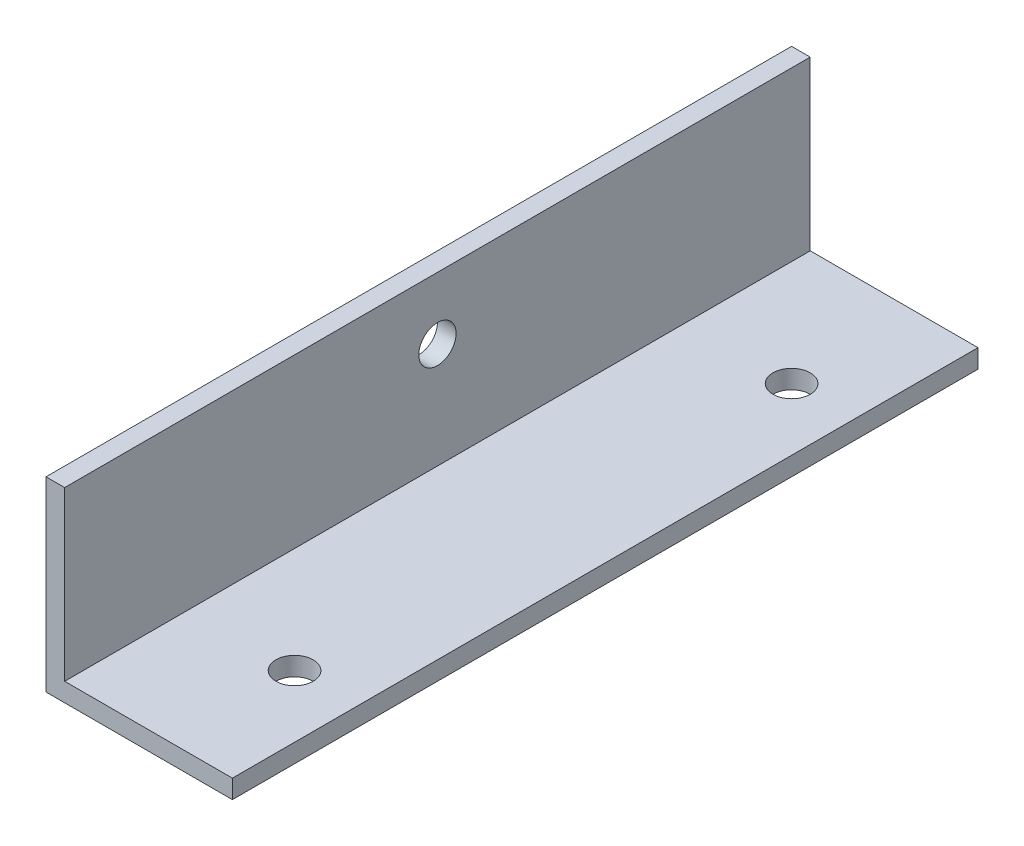
ISO-10303-21;
HEADER;
FILE_DESCRIPTION(('STEP AP214'),'2;1');
FILE_NAME('part.step','',(''),(''),'','','');
FILE_SCHEMA(('AUTOMOTIVE_DESIGN { 1 0 10303 214 1 1 1 1 }'));
ENDSEC;
DATA;
#1=APPLICATION_CONTEXT('core data for automotive mechanical design processes');
#2=APPLICATION_PROTOCOL_DEFINITION('international standard','automotive_design',2000,#1);
#3=PRODUCT_CONTEXT('',#1,'mechanical');
#4=PRODUCT('Part','Part','',(#3));
#5=PRODUCT_RELATED_PRODUCT_CATEGORY('part','',(#4));
#6=PRODUCT_DEFINITION_FORMATION('','',#4);
#7=PRODUCT_DEFINITION_CONTEXT('part definition',#1,'design');
#8=PRODUCT_DEFINITION('design','',#6,#7);
#9=PRODUCT_DEFINITION_SHAPE('','',#8);
#10=(LENGTH_UNIT() NAMED_UNIT(*) SI_UNIT(.MILLI.,.METRE.));
#11=(NAMED_UNIT(*) PLANE_ANGLE_UNIT() SI_UNIT($,.RADIAN.));
#12=(NAMED_UNIT(*) SI_UNIT($,.STERADIAN.) SOLID_ANGLE_UNIT());
#13=UNCERTAINTY_MEASURE_WITH_UNIT(LENGTH_MEASURE(1.E-05),#10,'distance_accuracy_value','');
#14=(GEOMETRIC_REPRESENTATION_CONTEXT(3) GLOBAL_UNCERTAINTY_ASSIGNED_CONTEXT((#13)) GLOBAL_UNIT_ASSIGNED_CONTEXT((#10,
#11,#12)) REPRESENTATION_CONTEXT('',''));
#15=CARTESIAN_POINT('',(0.,0.,0.));
#16=DIRECTION('',(0.,0.,1.));
#17=DIRECTION('',(1.,0.,0.));
#18=AXIS2_PLACEMENT_3D('',#15,#16,#17);
#19=CARTESIAN_POINT('',(0.,0.,60.));
#20=DIRECTION('',(1.,0.,0.));
#21=DIRECTION('',(0.,0.,-1.));
#22=AXIS2_PLACEMENT_3D('',#19,#20,#21);
#23=PLANE('',#22);
#24=CARTESIAN_POINT('',(0.,10.,30.));
#25=DIRECTION('',(-1.,0.,0.));
#26=DIRECTION('',(0.,0.,1.));
#27=AXIS2_PLACEMENT_3D('',#24,#25,#26);
#28=CIRCLE('',#27,1.5);
#29=CARTESIAN_POINT('',(0.,10.,31.5));
#30=VERTEX_POINT('',#29);
#31=EDGE_CURVE('E135',#30,#30,#28,.T.);
#32=ORIENTED_EDGE('',*,*,#31,.F.);
#33=EDGE_LOOP('',(#32));
#34=FACE_BOUND('',#33,.T.);
#35=DIRECTION('',(0.,-1.,0.));
#36=VECTOR('',#35,1.);
#37=CARTESIAN_POINT('',(0.,0.,0.));
#38=LINE('',#37,#36);
#39=CARTESIAN_POINT('',(0.,15.,0.));
#40=VERTEX_POINT('',#39);
#41=CARTESIAN_POINT('',(0.,0.,0.));
#42=VERTEX_POINT('',#41);
#43=EDGE_CURVE('E117',#40,#42,#38,.T.);
#44=ORIENTED_EDGE('',*,*,#43,.T.);
#45=DIRECTION('',(0.,0.,-1.));
#46=VECTOR('',#45,1.);
#47=CARTESIAN_POINT('',(0.,0.,60.));
#48=LINE('',#47,#46);
#49=CARTESIAN_POINT('',(0.,0.,60.));
#50=VERTEX_POINT('',#49);
#51=EDGE_CURVE('E11',#50,#42,#48,.T.);
#52=ORIENTED_EDGE('',*,*,#51,.F.);
#53=DIRECTION('',(0.,-1.,0.));
#54=VECTOR('',#53,1.);
#55=CARTESIAN_POINT('',(0.,0.,60.));
#56=LINE('',#55,#54);
#57=CARTESIAN_POINT('',(0.,15.,60.));
#58=VERTEX_POINT('',#57);
#59=EDGE_CURVE('E128',#58,#50,#56,.T.);
#60=ORIENTED_EDGE('',*,*,#59,.F.);
#61=DIRECTION('',(0.,0.,-1.));
#62=VECTOR('',#61,1.);
#63=CARTESIAN_POINT('',(0.,15.,60.));
#64=LINE('',#63,#62);
#65=EDGE_CURVE('E113',#58,#40,#64,.T.);
#66=ORIENTED_EDGE('',*,*,#65,.T.);
#67=EDGE_LOOP('',(#44,#52,#60,#66));
#68=FACE_BOUND('',#67,.T.);
#69=ADVANCED_FACE('F31',(#34,#68),#23,.F.);
#70=CARTESIAN_POINT('',(1.5,0.,60.));
#71=DIRECTION('',(0.,1.,0.));
#72=DIRECTION('',(0.,0.,1.));
#73=AXIS2_PLACEMENT_3D('',#70,#71,#72);
#74=PLANE('',#73);
#75=CARTESIAN_POINT('',(10.,0.,50.));
#76=DIRECTION('',(0.,-1.,0.));
#77=DIRECTION('',(0.,0.,-1.));
#78=AXIS2_PLACEMENT_3D('',#75,#76,#77);
#79=CIRCLE('',#78,1.5);
#80=CARTESIAN_POINT('',(10.,0.,48.5));
#81=VERTEX_POINT('',#80);
#82=EDGE_CURVE('E148',#81,#81,#79,.T.);
#83=ORIENTED_EDGE('',*,*,#82,.F.);
#84=EDGE_LOOP('',(#83));
#85=FACE_BOUND('',#84,.T.);
#86=CARTESIAN_POINT('',(10.,0.,10.));
#87=DIRECTION('',(0.,-1.,0.));
#88=DIRECTION('',(0.,0.,-1.));
#89=AXIS2_PLACEMENT_3D('',#86,#87,#88);
#90=CIRCLE('',#89,1.5);
#91=CARTESIAN_POINT('',(10.,0.,8.5));
#92=VERTEX_POINT('',#91);
#93=EDGE_CURVE('E138',#92,#92,#90,.T.);
#94=ORIENTED_EDGE('',*,*,#93,.F.);
#95=EDGE_LOOP('',(#94));
#96=FACE_BOUND('',#95,.T.);
#97=DIRECTION('',(1.,0.,0.));
#98=VECTOR('',#97,1.);
#99=CARTESIAN_POINT('',(1.5,0.,0.));
#100=LINE('',#99,#98);
#101=CARTESIAN_POINT('',(15.,0.,0.));
#102=VERTEX_POINT('',#101);
#103=EDGE_CURVE('E120',#42,#102,#100,.T.);
#104=ORIENTED_EDGE('',*,*,#103,.T.);
#105=DIRECTION('',(0.,0.,-1.));
#106=VECTOR('',#105,1.);
#107=CARTESIAN_POINT('',(15.,0.,60.));
#108=LINE('',#107,#106);
#109=CARTESIAN_POINT('',(15.,0.,60.));
#110=VERTEX_POINT('',#109);
#111=EDGE_CURVE('E40',#110,#102,#108,.T.);
#112=ORIENTED_EDGE('',*,*,#111,.F.);
#113=DIRECTION('',(1.,0.,0.));
#114=VECTOR('',#113,1.);
#115=CARTESIAN_POINT('',(0.,0.,60.));
#116=LINE('',#115,#114);
#117=EDGE_CURVE('E86',#50,#110,#116,.T.);
#118=ORIENTED_EDGE('',*,*,#117,.F.);
#119=ORIENTED_EDGE('',*,*,#51,.T.);
#120=EDGE_LOOP('',(#104,#112,#118,#119));
#121=FACE_BOUND('',#120,.T.);
#122=ADVANCED_FACE('F154',(#85,#96,#121),#74,.F.);
#123=CARTESIAN_POINT('',(15.,0.,60.));
#124=DIRECTION('',(-1.,0.,0.));
#125=DIRECTION('',(0.,0.,1.));
#126=AXIS2_PLACEMENT_3D('',#123,#124,#125);
#127=PLANE('',#126);
#128=DIRECTION('',(0.,1.,0.));
#129=VECTOR('',#128,1.);
#130=CARTESIAN_POINT('',(15.,0.,0.));
#131=LINE('',#130,#129);
#132=CARTESIAN_POINT('',(15.,1.5,0.));
#133=VERTEX_POINT('',#132);
#134=EDGE_CURVE('E123',#102,#133,#131,.T.);
#135=ORIENTED_EDGE('',*,*,#134,.T.);
#136=DIRECTION('',(0.,0.,-1.));
#137=VECTOR('',#136,1.);
#138=CARTESIAN_POINT('',(15.,1.5,60.));
#139=LINE('',#138,#137);
#140=CARTESIAN_POINT('',(15.,1.5,60.));
#141=VERTEX_POINT('',#140);
#142=EDGE_CURVE('E108',#141,#133,#139,.T.);
#143=ORIENTED_EDGE('',*,*,#142,.F.);
#144=DIRECTION('',(0.,1.,0.));
#145=VECTOR('',#144,1.);
#146=CARTESIAN_POINT('',(15.,0.,60.));
#147=LINE('',#146,#145);
#148=EDGE_CURVE('E99',#110,#141,#147,.T.);
#149=ORIENTED_EDGE('',*,*,#148,.F.);
#150=ORIENTED_EDGE('',*,*,#111,.T.);
#151=EDGE_LOOP('',(#135,#143,#149,#150));
#152=FACE_BOUND('',#151,.T.);
#153=ADVANCED_FACE('F157',(#152),#127,.F.);
#154=CARTESIAN_POINT('',(1.5,1.5,60.));
#155=DIRECTION('',(0.,-1.,0.));
#156=DIRECTION('',(0.,0.,-1.));
#157=AXIS2_PLACEMENT_3D('',#154,#155,#156);
#158=PLANE('',#157);
#159=CARTESIAN_POINT('',(10.,1.5,50.));
#160=DIRECTION('',(0.,-1.,0.));
#161=DIRECTION('',(0.,0.,-1.));
#162=AXIS2_PLACEMENT_3D('',#159,#160,#161);
#163=CIRCLE('',#162,1.5);
#164=CARTESIAN_POINT('',(10.,1.5,48.5));
#165=VERTEX_POINT('',#164);
#166=EDGE_CURVE('E34',#165,#165,#163,.T.);
#167=ORIENTED_EDGE('',*,*,#166,.T.);
#168=EDGE_LOOP('',(#167));
#169=FACE_BOUND('',#168,.T.);
#170=CARTESIAN_POINT('',(10.,1.5,10.));
#171=DIRECTION('',(0.,-1.,0.));
#172=DIRECTION('',(0.,0.,-1.));
#173=AXIS2_PLACEMENT_3D('',#170,#171,#172);
#174=CIRCLE('',#173,1.5);
#175=CARTESIAN_POINT('',(10.,1.5,8.5));
#176=VERTEX_POINT('',#175);
#177=EDGE_CURVE('E136',#176,#176,#174,.T.);
#178=ORIENTED_EDGE('',*,*,#177,.T.);
#179=EDGE_LOOP('',(#178));
#180=FACE_BOUND('',#179,.T.);
#181=DIRECTION('',(-1.,0.,0.));
#182=VECTOR('',#181,1.);
#183=CARTESIAN_POINT('',(1.5,1.5,0.));
#184=LINE('',#183,#182);
#185=CARTESIAN_POINT('',(1.5,1.5,0.));
#186=VERTEX_POINT('',#185);
#187=EDGE_CURVE('E107',#133,#186,#184,.T.);
#188=ORIENTED_EDGE('',*,*,#187,.T.);
#189=DIRECTION('',(0.,0.,-1.));
#190=VECTOR('',#189,1.);
#191=CARTESIAN_POINT('',(1.5,1.5,60.));
#192=LINE('',#191,#190);
#193=CARTESIAN_POINT('',(1.5,1.5,60.));
#194=VERTEX_POINT('',#193);
#195=EDGE_CURVE('E104',#194,#186,#192,.T.);
#196=ORIENTED_EDGE('',*,*,#195,.F.);
#197=DIRECTION('',(-1.,0.,0.));
#198=VECTOR('',#197,1.);
#199=CARTESIAN_POINT('',(1.5,1.5,60.));
#200=LINE('',#199,#198);
#201=EDGE_CURVE('E93',#141,#194,#200,.T.);
#202=ORIENTED_EDGE('',*,*,#201,.F.);
#203=ORIENTED_EDGE('',*,*,#142,.T.);
#204=EDGE_LOOP('',(#188,#196,#202,#203));
#205=FACE_BOUND('',#204,.T.);
#206=ADVANCED_FACE('F105',(#169,#180,#205),#158,.F.);
#207=CARTESIAN_POINT('',(1.5,1.5,60.));
#208=DIRECTION('',(-1.,0.,0.));
#209=DIRECTION('',(0.,0.,1.));
#210=AXIS2_PLACEMENT_3D('',#207,#208,#209);
#211=PLANE('',#210);
#212=CARTESIAN_POINT('',(1.5,10.,30.));
#213=DIRECTION('',(-1.,0.,0.));
#214=DIRECTION('',(0.,0.,1.));
#215=AXIS2_PLACEMENT_3D('',#212,#213,#214);
#216=CIRCLE('',#215,1.5);
#217=CARTESIAN_POINT('',(1.5,10.,31.5));
#218=VERTEX_POINT('',#217);
#219=EDGE_CURVE('E121',#218,#218,#216,.T.);
#220=ORIENTED_EDGE('',*,*,#219,.T.);
#221=EDGE_LOOP('',(#220));
#222=FACE_BOUND('',#221,.T.);
#223=DIRECTION('',(0.,1.,0.));
#224=VECTOR('',#223,1.);
#225=CARTESIAN_POINT('',(1.5,1.5,0.));
#226=LINE('',#225,#224);
#227=CARTESIAN_POINT('',(1.5,15.,0.));
#228=VERTEX_POINT('',#227);
#229=EDGE_CURVE('E72',#186,#228,#226,.T.);
#230=ORIENTED_EDGE('',*,*,#229,.T.);
#231=DIRECTION('',(0.,0.,-1.));
#232=VECTOR('',#231,1.);
#233=CARTESIAN_POINT('',(1.5,15.,60.));
#234=LINE('',#233,#232);
#235=CARTESIAN_POINT('',(1.5,15.,60.));
#236=VERTEX_POINT('',#235);
#237=EDGE_CURVE('E109',#236,#228,#234,.T.);
#238=ORIENTED_EDGE('',*,*,#237,.F.);
#239=DIRECTION('',(0.,1.,0.));
#240=VECTOR('',#239,1.);
#241=CARTESIAN_POINT('',(1.5,1.5,60.));
#242=LINE('',#241,#240);
#243=EDGE_CURVE('E97',#194,#236,#242,.T.);
#244=ORIENTED_EDGE('',*,*,#243,.F.);
#245=ORIENTED_EDGE('',*,*,#195,.T.);
#246=EDGE_LOOP('',(#230,#238,#244,#245));
#247=FACE_BOUND('',#246,.T.);
#248=ADVANCED_FACE('F111',(#222,#247),#211,.F.);
#249=CARTESIAN_POINT('',(0.,15.,60.));
#250=DIRECTION('',(0.,-1.,0.));
#251=DIRECTION('',(0.,0.,-1.));
#252=AXIS2_PLACEMENT_3D('',#249,#250,#251);
#253=PLANE('',#252);
#254=DIRECTION('',(-1.,0.,0.));
#255=VECTOR('',#254,1.);
#256=CARTESIAN_POINT('',(0.,15.,0.));
#257=LINE('',#256,#255);
#258=EDGE_CURVE('E78',#228,#40,#257,.T.);
#259=ORIENTED_EDGE('',*,*,#258,.T.);
#260=ORIENTED_EDGE('',*,*,#65,.F.);
#261=DIRECTION('',(-1.,0.,0.));
#262=VECTOR('',#261,1.);
#263=CARTESIAN_POINT('',(0.,15.,60.));
#264=LINE('',#263,#262);
#265=EDGE_CURVE('E49',#236,#58,#264,.T.);
#266=ORIENTED_EDGE('',*,*,#265,.F.);
#267=ORIENTED_EDGE('',*,*,#237,.T.);
#268=EDGE_LOOP('',(#259,#260,#266,#267));
#269=FACE_BOUND('',#268,.T.);
#270=ADVANCED_FACE('F162',(#269),#253,.F.);
#271=CARTESIAN_POINT('',(0.,15.,60.));
#272=DIRECTION('',(0.,0.,-1.));
#273=DIRECTION('',(-1.,0.,0.));
#274=AXIS2_PLACEMENT_3D('',#271,#272,#273);
#275=PLANE('',#274);
#276=ORIENTED_EDGE('',*,*,#59,.T.);
#277=ORIENTED_EDGE('',*,*,#117,.T.);
#278=ORIENTED_EDGE('',*,*,#148,.T.);
#279=ORIENTED_EDGE('',*,*,#201,.T.);
#280=ORIENTED_EDGE('',*,*,#243,.T.);
#281=ORIENTED_EDGE('',*,*,#265,.T.);
#282=EDGE_LOOP('',(#276,#277,#278,#279,#280,#281));
#283=FACE_BOUND('',#282,.T.);
#284=ADVANCED_FACE('F95',(#283),#275,.F.);
#285=CARTESIAN_POINT('',(0.,15.,0.));
#286=DIRECTION('',(0.,0.,-1.));
#287=DIRECTION('',(-1.,0.,0.));
#288=AXIS2_PLACEMENT_3D('',#285,#286,#287);
#289=PLANE('',#288);
#290=ORIENTED_EDGE('',*,*,#43,.F.);
#291=ORIENTED_EDGE('',*,*,#258,.F.);
#292=ORIENTED_EDGE('',*,*,#229,.F.);
#293=ORIENTED_EDGE('',*,*,#187,.F.);
#294=ORIENTED_EDGE('',*,*,#134,.F.);
#295=ORIENTED_EDGE('',*,*,#103,.F.);
#296=EDGE_LOOP('',(#290,#291,#292,#293,#294,#295));
#297=FACE_BOUND('',#296,.T.);
#298=ADVANCED_FACE('F160',(#297),#289,.T.);
#299=CARTESIAN_POINT('',(60.,10.,30.));
#300=DIRECTION('',(-1.,0.,0.));
#301=DIRECTION('',(0.,0.,1.));
#302=AXIS2_PLACEMENT_3D('',#299,#300,#301);
#303=CYLINDRICAL_SURFACE('',#302,1.5);
#304=ORIENTED_EDGE('',*,*,#31,.T.);
#305=EDGE_LOOP('',(#304));
#306=FACE_BOUND('',#305,.T.);
#307=ORIENTED_EDGE('',*,*,#219,.F.);
#308=EDGE_LOOP('',(#307));
#309=FACE_BOUND('',#308,.T.);
#310=ADVANCED_FACE('F181',(#306,#309),#303,.F.);
#311=CARTESIAN_POINT('',(10.,60.,10.));
#312=DIRECTION('',(0.,-1.,0.));
#313=DIRECTION('',(0.,0.,-1.));
#314=AXIS2_PLACEMENT_3D('',#311,#312,#313);
#315=CYLINDRICAL_SURFACE('',#314,1.5);
#316=ORIENTED_EDGE('',*,*,#93,.T.);
#317=EDGE_LOOP('',(#316));
#318=FACE_BOUND('',#317,.T.);
#319=ORIENTED_EDGE('',*,*,#177,.F.);
#320=EDGE_LOOP('',(#319));
#321=FACE_BOUND('',#320,.T.);
#322=ADVANCED_FACE('F184',(#318,#321),#315,.F.);
#323=CARTESIAN_POINT('',(10.,60.,50.));
#324=DIRECTION('',(0.,-1.,0.));
#325=DIRECTION('',(0.,0.,-1.));
#326=AXIS2_PLACEMENT_3D('',#323,#324,#325);
#327=CYLINDRICAL_SURFACE('',#326,1.5);
#328=ORIENTED_EDGE('',*,*,#82,.T.);
#329=EDGE_LOOP('',(#328));
#330=FACE_BOUND('',#329,.T.);
#331=ORIENTED_EDGE('',*,*,#166,.F.);
#332=EDGE_LOOP('',(#331));
#333=FACE_BOUND('',#332,.T.);
#334=ADVANCED_FACE('F191',(#330,#333),#327,.F.);
#335=CLOSED_SHELL('',(#69,#122,#153,#206,#248,#270,#284,#298,#310,#322,#334));
#336=MANIFOLD_SOLID_BREP('B2',#335);
#337=ADVANCED_BREP_SHAPE_REPRESENTATION('',(#18,#336),#14);
#338=SHAPE_DEFINITION_REPRESENTATION(#9,#337);
ENDSEC;
END-ISO-10303-21;
